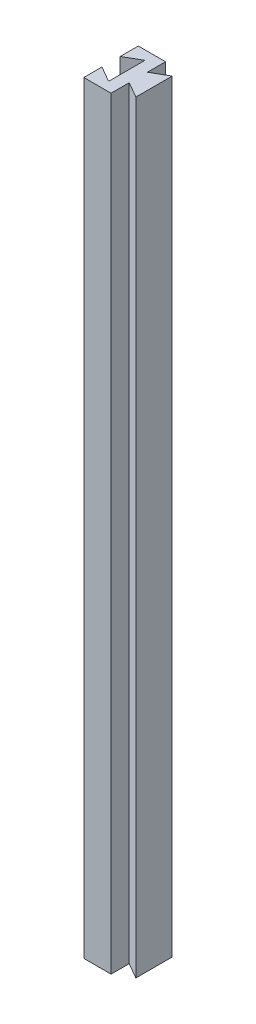
ISO-10303-21;
HEADER;
FILE_DESCRIPTION(('STEP AP214'),'2;1');
FILE_NAME('part.step','',(''),(''),'','','');
FILE_SCHEMA(('AUTOMOTIVE_DESIGN { 1 0 10303 214 1 1 1 1 }'));
ENDSEC;
DATA;
#1=APPLICATION_CONTEXT('core data for automotive mechanical design processes');
#2=APPLICATION_PROTOCOL_DEFINITION('international standard','automotive_design',2000,#1);
#3=PRODUCT_CONTEXT('',#1,'mechanical');
#4=PRODUCT('Part','Part','',(#3));
#5=PRODUCT_RELATED_PRODUCT_CATEGORY('part','',(#4));
#6=PRODUCT_DEFINITION_FORMATION('','',#4);
#7=PRODUCT_DEFINITION_CONTEXT('part definition',#1,'design');
#8=PRODUCT_DEFINITION('design','',#6,#7);
#9=PRODUCT_DEFINITION_SHAPE('','',#8);
#10=(LENGTH_UNIT() NAMED_UNIT(*) SI_UNIT(.MILLI.,.METRE.));
#11=(NAMED_UNIT(*) PLANE_ANGLE_UNIT() SI_UNIT($,.RADIAN.));
#12=(NAMED_UNIT(*) SI_UNIT($,.STERADIAN.) SOLID_ANGLE_UNIT());
#13=UNCERTAINTY_MEASURE_WITH_UNIT(LENGTH_MEASURE(1.E-05),#10,'distance_accuracy_value','');
#14=(GEOMETRIC_REPRESENTATION_CONTEXT(3) GLOBAL_UNCERTAINTY_ASSIGNED_CONTEXT((#13)) GLOBAL_UNIT_ASSIGNED_CONTEXT((#10,
#11,#12)) REPRESENTATION_CONTEXT('',''));
#15=CARTESIAN_POINT('',(0.,0.,0.));
#16=DIRECTION('',(0.,0.,1.));
#17=DIRECTION('',(1.,0.,0.));
#18=AXIS2_PLACEMENT_3D('',#15,#16,#17);
#19=CARTESIAN_POINT('',(-45.7953097514779,355.6,-6.96717641814465));
#20=DIRECTION('',(1.,0.,0.));
#21=DIRECTION('',(0.,0.,-1.));
#22=AXIS2_PLACEMENT_3D('',#19,#20,#21);
#23=PLANE('',#22);
#24=DIRECTION('',(0.,0.,1.));
#25=VECTOR('',#24,1.);
#26=CARTESIAN_POINT('',(-45.7953097514779,0.,-6.96717641814465));
#27=LINE('',#26,#25);
#28=CARTESIAN_POINT('',(-45.7953097514779,0.,-6.96717641814465));
#29=VERTEX_POINT('',#28);
#30=CARTESIAN_POINT('',(-45.7953097514779,0.,1.49949024852419));
#31=VERTEX_POINT('',#30);
#32=EDGE_CURVE('E153',#29,#31,#27,.T.);
#33=ORIENTED_EDGE('',*,*,#32,.T.);
#34=DIRECTION('',(0.,-1.,0.));
#35=VECTOR('',#34,1.);
#36=CARTESIAN_POINT('',(-45.7953097514779,355.6,1.49949024852419));
#37=LINE('',#36,#35);
#38=CARTESIAN_POINT('',(-45.7953097514779,355.6,1.49949024852419));
#39=VERTEX_POINT('',#38);
#40=EDGE_CURVE('E11',#39,#31,#37,.T.);
#41=ORIENTED_EDGE('',*,*,#40,.F.);
#42=DIRECTION('',(0.,0.,1.));
#43=VECTOR('',#42,1.);
#44=CARTESIAN_POINT('',(-45.7953097514779,355.6,-6.96717641814465));
#45=LINE('',#44,#43);
#46=CARTESIAN_POINT('',(-45.7953097514779,355.6,-6.96717641814465));
#47=VERTEX_POINT('',#46);
#48=EDGE_CURVE('E175',#47,#39,#45,.T.);
#49=ORIENTED_EDGE('',*,*,#48,.F.);
#50=DIRECTION('',(0.,-1.,0.));
#51=VECTOR('',#50,1.);
#52=CARTESIAN_POINT('',(-45.7953097514779,355.6,-6.96717641814465));
#53=LINE('',#52,#51);
#54=EDGE_CURVE('E149',#47,#29,#53,.T.);
#55=ORIENTED_EDGE('',*,*,#54,.T.);
#56=EDGE_LOOP('',(#33,#41,#49,#55));
#57=FACE_BOUND('',#56,.T.);
#58=ADVANCED_FACE('F33',(#57),#23,.F.);
#59=CARTESIAN_POINT('',(-38.4629613327699,355.6,-2.73384308480952));
#60=DIRECTION('',(-0.500000000000045,0.,-0.866025403784413));
#61=DIRECTION('',(-0.866025403784413,0.,0.500000000000045));
#62=AXIS2_PLACEMENT_3D('',#59,#60,#61);
#63=PLANE('',#62);
#64=DIRECTION('',(0.866025403784413,0.,-0.500000000000045));
#65=VECTOR('',#64,1.);
#66=CARTESIAN_POINT('',(-38.4629613327699,0.,-2.73384308480952));
#67=LINE('',#66,#65);
#68=CARTESIAN_POINT('',(-38.4629613327699,0.,-2.73384308480952));
#69=VERTEX_POINT('',#68);
#70=EDGE_CURVE('E156',#31,#69,#67,.T.);
#71=ORIENTED_EDGE('',*,*,#70,.T.);
#72=DIRECTION('',(0.,-1.,0.));
#73=VECTOR('',#72,1.);
#74=CARTESIAN_POINT('',(-38.4629613327699,355.6,-2.73384308480952));
#75=LINE('',#74,#73);
#76=CARTESIAN_POINT('',(-38.4629613327699,355.6,-2.73384308480952));
#77=VERTEX_POINT('',#76);
#78=EDGE_CURVE('E41',#77,#69,#75,.T.);
#79=ORIENTED_EDGE('',*,*,#78,.F.);
#80=DIRECTION('',(0.866025403784413,0.,-0.500000000000045));
#81=VECTOR('',#80,1.);
#82=CARTESIAN_POINT('',(-38.4629613327699,355.6,-2.73384308480952));
#83=LINE('',#82,#81);
#84=EDGE_CURVE('E104',#39,#77,#83,.T.);
#85=ORIENTED_EDGE('',*,*,#84,.F.);
#86=ORIENTED_EDGE('',*,*,#40,.T.);
#87=EDGE_LOOP('',(#71,#79,#85,#86));
#88=FACE_BOUND('',#87,.T.);
#89=ADVANCED_FACE('F253',(#88),#63,.F.);
#90=CARTESIAN_POINT('',(-38.4629613327699,355.6,14.1994902485238));
#91=DIRECTION('',(1.,0.,0.));
#92=DIRECTION('',(0.,0.,-1.));
#93=AXIS2_PLACEMENT_3D('',#90,#91,#92);
#94=PLANE('',#93);
#95=DIRECTION('',(0.,0.,1.));
#96=VECTOR('',#95,1.);
#97=CARTESIAN_POINT('',(-38.4629613327699,0.,14.1994902485238));
#98=LINE('',#97,#96);
#99=CARTESIAN_POINT('',(-38.4629613327699,0.,14.1994902485238));
#100=VERTEX_POINT('',#99);
#101=EDGE_CURVE('E158',#69,#100,#98,.T.);
#102=ORIENTED_EDGE('',*,*,#101,.T.);
#103=DIRECTION('',(0.,-1.,0.));
#104=VECTOR('',#103,1.);
#105=CARTESIAN_POINT('',(-38.4629613327699,355.6,14.1994902485238));
#106=LINE('',#105,#104);
#107=CARTESIAN_POINT('',(-38.4629613327699,355.6,14.1994902485238));
#108=VERTEX_POINT('',#107);
#109=EDGE_CURVE('E194',#108,#100,#106,.T.);
#110=ORIENTED_EDGE('',*,*,#109,.F.);
#111=DIRECTION('',(0.,0.,1.));
#112=VECTOR('',#111,1.);
#113=CARTESIAN_POINT('',(-38.4629613327699,355.6,14.1994902485238));
#114=LINE('',#113,#112);
#115=EDGE_CURVE('E202',#77,#108,#114,.T.);
#116=ORIENTED_EDGE('',*,*,#115,.F.);
#117=ORIENTED_EDGE('',*,*,#78,.T.);
#118=EDGE_LOOP('',(#102,#110,#116,#117));
#119=FACE_BOUND('',#118,.T.);
#120=ADVANCED_FACE('F200',(#119),#94,.F.);
#121=CARTESIAN_POINT('',(-45.7953097514779,355.6,9.96615691519011));
#122=DIRECTION('',(-0.500000000000043,0.,0.866025403784414));
#123=DIRECTION('',(0.866025403784414,0.,0.500000000000043));
#124=AXIS2_PLACEMENT_3D('',#121,#122,#123);
#125=PLANE('',#124);
#126=DIRECTION('',(-0.866025403784414,0.,-0.500000000000043));
#127=VECTOR('',#126,1.);
#128=CARTESIAN_POINT('',(-45.7953097514779,0.,9.96615691519011));
#129=LINE('',#128,#127);
#130=CARTESIAN_POINT('',(-45.7953097514779,0.,9.96615691519011));
#131=VERTEX_POINT('',#130);
#132=EDGE_CURVE('E160',#100,#131,#129,.T.);
#133=ORIENTED_EDGE('',*,*,#132,.T.);
#134=DIRECTION('',(0.,-1.,0.));
#135=VECTOR('',#134,1.);
#136=CARTESIAN_POINT('',(-45.7953097514779,355.6,9.96615691519011));
#137=LINE('',#136,#135);
#138=CARTESIAN_POINT('',(-45.7953097514779,355.6,9.96615691519011));
#139=VERTEX_POINT('',#138);
#140=EDGE_CURVE('E191',#139,#131,#137,.T.);
#141=ORIENTED_EDGE('',*,*,#140,.F.);
#142=DIRECTION('',(-0.866025403784414,0.,-0.500000000000043));
#143=VECTOR('',#142,1.);
#144=CARTESIAN_POINT('',(-45.7953097514779,355.6,9.96615691519011));
#145=LINE('',#144,#143);
#146=EDGE_CURVE('E220',#108,#139,#145,.T.);
#147=ORIENTED_EDGE('',*,*,#146,.F.);
#148=ORIENTED_EDGE('',*,*,#109,.T.);
#149=EDGE_LOOP('',(#133,#141,#147,#148));
#150=FACE_BOUND('',#149,.T.);
#151=ADVANCED_FACE('F211',(#150),#125,.F.);
#152=CARTESIAN_POINT('',(-45.7953097514779,355.6,9.96615691519011));
#153=DIRECTION('',(1.,0.,0.));
#154=DIRECTION('',(0.,0.,-1.));
#155=AXIS2_PLACEMENT_3D('',#152,#153,#154);
#156=PLANE('',#155);
#157=DIRECTION('',(0.,0.,1.));
#158=VECTOR('',#157,1.);
#159=CARTESIAN_POINT('',(-45.7953097514779,0.,9.96615691519011));
#160=LINE('',#159,#158);
#161=CARTESIAN_POINT('',(-45.7953097514779,0.,18.4328235818553));
#162=VERTEX_POINT('',#161);
#163=EDGE_CURVE('E162',#131,#162,#160,.T.);
#164=ORIENTED_EDGE('',*,*,#163,.T.);
#165=DIRECTION('',(0.,-1.,0.));
#166=VECTOR('',#165,1.);
#167=CARTESIAN_POINT('',(-45.7953097514779,355.6,18.4328235818553));
#168=LINE('',#167,#166);
#169=CARTESIAN_POINT('',(-45.7953097514779,355.6,18.4328235818553));
#170=VERTEX_POINT('',#169);
#171=EDGE_CURVE('E188',#170,#162,#168,.T.);
#172=ORIENTED_EDGE('',*,*,#171,.F.);
#173=DIRECTION('',(0.,0.,1.));
#174=VECTOR('',#173,1.);
#175=CARTESIAN_POINT('',(-45.7953097514779,355.6,9.96615691519011));
#176=LINE('',#175,#174);
#177=EDGE_CURVE('E217',#139,#170,#176,.T.);
#178=ORIENTED_EDGE('',*,*,#177,.F.);
#179=ORIENTED_EDGE('',*,*,#140,.T.);
#180=EDGE_LOOP('',(#164,#172,#178,#179));
#181=FACE_BOUND('',#180,.T.);
#182=ADVANCED_FACE('F215',(#181),#156,.F.);
#183=CARTESIAN_POINT('',(-45.7953097514779,355.6,18.4328235818553));
#184=DIRECTION('',(0.,0.,-1.));
#185=DIRECTION('',(-1.,0.,0.));
#186=AXIS2_PLACEMENT_3D('',#183,#184,#185);
#187=PLANE('',#186);
#188=DIRECTION('',(1.,0.,0.));
#189=VECTOR('',#188,1.);
#190=CARTESIAN_POINT('',(-45.7953097514779,0.,18.4328235818553));
#191=LINE('',#190,#189);
#192=CARTESIAN_POINT('',(-33.0953097514779,0.,18.4328235818553));
#193=VERTEX_POINT('',#192);
#194=EDGE_CURVE('E164',#162,#193,#191,.T.);
#195=ORIENTED_EDGE('',*,*,#194,.T.);
#196=DIRECTION('',(0.,-1.,0.));
#197=VECTOR('',#196,1.);
#198=CARTESIAN_POINT('',(-33.0953097514779,355.6,18.4328235818553));
#199=LINE('',#198,#197);
#200=CARTESIAN_POINT('',(-33.0953097514779,355.6,18.4328235818553));
#201=VERTEX_POINT('',#200);
#202=EDGE_CURVE('E185',#201,#193,#199,.T.);
#203=ORIENTED_EDGE('',*,*,#202,.F.);
#204=DIRECTION('',(1.,0.,0.));
#205=VECTOR('',#204,1.);
#206=CARTESIAN_POINT('',(-45.7953097514779,355.6,18.4328235818553));
#207=LINE('',#206,#205);
#208=EDGE_CURVE('E219',#170,#201,#207,.T.);
#209=ORIENTED_EDGE('',*,*,#208,.F.);
#210=ORIENTED_EDGE('',*,*,#171,.T.);
#211=EDGE_LOOP('',(#195,#203,#209,#210));
#212=FACE_BOUND('',#211,.T.);
#213=ADVANCED_FACE('F266',(#212),#187,.F.);
#214=CARTESIAN_POINT('',(-33.0953097514779,355.6,18.4328235818553));
#215=DIRECTION('',(-1.,0.,0.));
#216=DIRECTION('',(0.,0.,1.));
#217=AXIS2_PLACEMENT_3D('',#214,#215,#216);
#218=PLANE('',#217);
#219=DIRECTION('',(0.,0.,-1.));
#220=VECTOR('',#219,1.);
#221=CARTESIAN_POINT('',(-33.0953097514779,0.,18.4328235818553));
#222=LINE('',#221,#220);
#223=CARTESIAN_POINT('',(-33.0953097514779,0.,9.96615691518868));
#224=VERTEX_POINT('',#223);
#225=EDGE_CURVE('E166',#193,#224,#222,.T.);
#226=ORIENTED_EDGE('',*,*,#225,.T.);
#227=DIRECTION('',(0.,-1.,0.));
#228=VECTOR('',#227,1.);
#229=CARTESIAN_POINT('',(-33.0953097514779,355.6,9.96615691518868));
#230=LINE('',#229,#228);
#231=CARTESIAN_POINT('',(-33.0953097514779,355.6,9.96615691518868));
#232=VERTEX_POINT('',#231);
#233=EDGE_CURVE('E182',#232,#224,#230,.T.);
#234=ORIENTED_EDGE('',*,*,#233,.F.);
#235=DIRECTION('',(0.,0.,-1.));
#236=VECTOR('',#235,1.);
#237=CARTESIAN_POINT('',(-33.0953097514779,355.6,18.4328235818553));
#238=LINE('',#237,#236);
#239=EDGE_CURVE('E222',#201,#232,#238,.T.);
#240=ORIENTED_EDGE('',*,*,#239,.F.);
#241=ORIENTED_EDGE('',*,*,#202,.T.);
#242=EDGE_LOOP('',(#226,#234,#240,#241));
#243=FACE_BOUND('',#242,.T.);
#244=ADVANCED_FACE('F269',(#243),#218,.F.);
#245=CARTESIAN_POINT('',(-33.0953097514779,355.6,9.96615691518868));
#246=DIRECTION('',(0.500000000000063,0.,-0.866025403784402));
#247=DIRECTION('',(-0.866025403784402,0.,-0.500000000000063));
#248=AXIS2_PLACEMENT_3D('',#245,#246,#247);
#249=PLANE('',#248);
#250=DIRECTION('',(0.866025403784402,0.,0.500000000000063));
#251=VECTOR('',#250,1.);
#252=CARTESIAN_POINT('',(-33.0953097514779,0.,9.96615691518868));
#253=LINE('',#252,#251);
#254=CARTESIAN_POINT('',(-25.76296133277,0.,14.1994902485226));
#255=VERTEX_POINT('',#254);
#256=EDGE_CURVE('E168',#224,#255,#253,.T.);
#257=ORIENTED_EDGE('',*,*,#256,.T.);
#258=DIRECTION('',(0.,-1.,0.));
#259=VECTOR('',#258,1.);
#260=CARTESIAN_POINT('',(-25.76296133277,355.6,14.1994902485226));
#261=LINE('',#260,#259);
#262=CARTESIAN_POINT('',(-25.76296133277,355.6,14.1994902485226));
#263=VERTEX_POINT('',#262);
#264=EDGE_CURVE('E179',#263,#255,#261,.T.);
#265=ORIENTED_EDGE('',*,*,#264,.F.);
#266=DIRECTION('',(0.866025403784402,0.,0.500000000000063));
#267=VECTOR('',#266,1.);
#268=CARTESIAN_POINT('',(-33.0953097514779,355.6,9.96615691518868));
#269=LINE('',#268,#267);
#270=EDGE_CURVE('E228',#232,#263,#269,.T.);
#271=ORIENTED_EDGE('',*,*,#270,.F.);
#272=ORIENTED_EDGE('',*,*,#233,.T.);
#273=EDGE_LOOP('',(#257,#265,#271,#272));
#274=FACE_BOUND('',#273,.T.);
#275=ADVANCED_FACE('F234',(#274),#249,.F.);
#276=CARTESIAN_POINT('',(-25.76296133277,355.6,-2.73384308481078));
#277=DIRECTION('',(-1.,0.,0.));
#278=DIRECTION('',(0.,0.,1.));
#279=AXIS2_PLACEMENT_3D('',#276,#277,#278);
#280=PLANE('',#279);
#281=DIRECTION('',(0.,0.,-1.));
#282=VECTOR('',#281,1.);
#283=CARTESIAN_POINT('',(-25.76296133277,0.,-2.73384308481078));
#284=LINE('',#283,#282);
#285=CARTESIAN_POINT('',(-25.76296133277,0.,-2.73384308481078));
#286=VERTEX_POINT('',#285);
#287=EDGE_CURVE('E170',#255,#286,#284,.T.);
#288=ORIENTED_EDGE('',*,*,#287,.T.);
#289=DIRECTION('',(0.,-1.,0.));
#290=VECTOR('',#289,1.);
#291=CARTESIAN_POINT('',(-25.76296133277,355.6,-2.73384308481078));
#292=LINE('',#291,#290);
#293=CARTESIAN_POINT('',(-25.76296133277,355.6,-2.73384308481078));
#294=VERTEX_POINT('',#293);
#295=EDGE_CURVE('E144',#294,#286,#292,.T.);
#296=ORIENTED_EDGE('',*,*,#295,.F.);
#297=DIRECTION('',(0.,0.,-1.));
#298=VECTOR('',#297,1.);
#299=CARTESIAN_POINT('',(-25.76296133277,355.6,-2.73384308481078));
#300=LINE('',#299,#298);
#301=EDGE_CURVE('E135',#263,#294,#300,.T.);
#302=ORIENTED_EDGE('',*,*,#301,.F.);
#303=ORIENTED_EDGE('',*,*,#264,.T.);
#304=EDGE_LOOP('',(#288,#296,#302,#303));
#305=FACE_BOUND('',#304,.T.);
#306=ADVANCED_FACE('F238',(#305),#280,.F.);
#307=CARTESIAN_POINT('',(-33.0953097514785,355.6,1.49949024852201));
#308=DIRECTION('',(0.499999999999936,0.,0.866025403784475));
#309=DIRECTION('',(0.866025403784475,0.,-0.499999999999936));
#310=AXIS2_PLACEMENT_3D('',#307,#308,#309);
#311=PLANE('',#310);
#312=DIRECTION('',(-0.866025403784475,0.,0.499999999999936));
#313=VECTOR('',#312,1.);
#314=CARTESIAN_POINT('',(-33.0953097514785,0.,1.49949024852201));
#315=LINE('',#314,#313);
#316=CARTESIAN_POINT('',(-33.0953097514785,0.,1.49949024852201));
#317=VERTEX_POINT('',#316);
#318=EDGE_CURVE('E143',#286,#317,#315,.T.);
#319=ORIENTED_EDGE('',*,*,#318,.T.);
#320=DIRECTION('',(0.,-1.,0.));
#321=VECTOR('',#320,1.);
#322=CARTESIAN_POINT('',(-33.0953097514785,355.6,1.49949024852201));
#323=LINE('',#322,#321);
#324=CARTESIAN_POINT('',(-33.0953097514785,355.6,1.49949024852201));
#325=VERTEX_POINT('',#324);
#326=EDGE_CURVE('E140',#325,#317,#323,.T.);
#327=ORIENTED_EDGE('',*,*,#326,.F.);
#328=DIRECTION('',(-0.866025403784475,0.,0.499999999999936));
#329=VECTOR('',#328,1.);
#330=CARTESIAN_POINT('',(-33.0953097514785,355.6,1.49949024852201));
#331=LINE('',#330,#329);
#332=EDGE_CURVE('E129',#294,#325,#331,.T.);
#333=ORIENTED_EDGE('',*,*,#332,.F.);
#334=ORIENTED_EDGE('',*,*,#295,.T.);
#335=EDGE_LOOP('',(#319,#327,#333,#334));
#336=FACE_BOUND('',#335,.T.);
#337=ADVANCED_FACE('F141',(#336),#311,.F.);
#338=CARTESIAN_POINT('',(-33.0953097514785,355.6,-6.96717641814465));
#339=DIRECTION('',(-1.,0.,0.));
#340=DIRECTION('',(0.,0.,1.));
#341=AXIS2_PLACEMENT_3D('',#338,#339,#340);
#342=PLANE('',#341);
#343=DIRECTION('',(0.,0.,-1.));
#344=VECTOR('',#343,1.);
#345=CARTESIAN_POINT('',(-33.0953097514785,0.,-6.96717641814465));
#346=LINE('',#345,#344);
#347=CARTESIAN_POINT('',(-33.0953097514785,0.,-6.96717641814465));
#348=VERTEX_POINT('',#347);
#349=EDGE_CURVE('E90',#317,#348,#346,.T.);
#350=ORIENTED_EDGE('',*,*,#349,.T.);
#351=DIRECTION('',(0.,-1.,0.));
#352=VECTOR('',#351,1.);
#353=CARTESIAN_POINT('',(-33.0953097514785,355.6,-6.96717641814465));
#354=LINE('',#353,#352);
#355=CARTESIAN_POINT('',(-33.0953097514785,355.6,-6.96717641814465));
#356=VERTEX_POINT('',#355);
#357=EDGE_CURVE('E145',#356,#348,#354,.T.);
#358=ORIENTED_EDGE('',*,*,#357,.F.);
#359=DIRECTION('',(0.,0.,-1.));
#360=VECTOR('',#359,1.);
#361=CARTESIAN_POINT('',(-33.0953097514785,355.6,-6.96717641814465));
#362=LINE('',#361,#360);
#363=EDGE_CURVE('E133',#325,#356,#362,.T.);
#364=ORIENTED_EDGE('',*,*,#363,.F.);
#365=ORIENTED_EDGE('',*,*,#326,.T.);
#366=EDGE_LOOP('',(#350,#358,#364,#365));
#367=FACE_BOUND('',#366,.T.);
#368=ADVANCED_FACE('F147',(#367),#342,.F.);
#369=CARTESIAN_POINT('',(-33.0953097514785,355.6,-6.96717641814465));
#370=DIRECTION('',(0.,0.,1.));
#371=DIRECTION('',(1.,0.,0.));
#372=AXIS2_PLACEMENT_3D('',#369,#370,#371);
#373=PLANE('',#372);
#374=DIRECTION('',(-1.,0.,0.));
#375=VECTOR('',#374,1.);
#376=CARTESIAN_POINT('',(-33.0953097514785,0.,-6.96717641814465));
#377=LINE('',#376,#375);
#378=EDGE_CURVE('E96',#348,#29,#377,.T.);
#379=ORIENTED_EDGE('',*,*,#378,.T.);
#380=ORIENTED_EDGE('',*,*,#54,.F.);
#381=DIRECTION('',(-1.,0.,0.));
#382=VECTOR('',#381,1.);
#383=CARTESIAN_POINT('',(-33.0953097514785,355.6,-6.96717641814465));
#384=LINE('',#383,#382);
#385=EDGE_CURVE('E49',#356,#47,#384,.T.);
#386=ORIENTED_EDGE('',*,*,#385,.F.);
#387=ORIENTED_EDGE('',*,*,#357,.T.);
#388=EDGE_LOOP('',(#379,#380,#386,#387));
#389=FACE_BOUND('',#388,.T.);
#390=ADVANCED_FACE('F242',(#389),#373,.F.);
#391=CARTESIAN_POINT('',(0.,355.6,0.));
#392=DIRECTION('',(0.,1.,0.));
#393=DIRECTION('',(0.,0.,1.));
#394=AXIS2_PLACEMENT_3D('',#391,#392,#393);
#395=PLANE('',#394);
#396=ORIENTED_EDGE('',*,*,#48,.T.);
#397=ORIENTED_EDGE('',*,*,#84,.T.);
#398=ORIENTED_EDGE('',*,*,#115,.T.);
#399=ORIENTED_EDGE('',*,*,#146,.T.);
#400=ORIENTED_EDGE('',*,*,#177,.T.);
#401=ORIENTED_EDGE('',*,*,#208,.T.);
#402=ORIENTED_EDGE('',*,*,#239,.T.);
#403=ORIENTED_EDGE('',*,*,#270,.T.);
#404=ORIENTED_EDGE('',*,*,#301,.T.);
#405=ORIENTED_EDGE('',*,*,#332,.T.);
#406=ORIENTED_EDGE('',*,*,#363,.T.);
#407=ORIENTED_EDGE('',*,*,#385,.T.);
#408=EDGE_LOOP('',(#396,#397,#398,#399,#400,#401,#402,#403,#404,#405,#406,#407));
#409=FACE_BOUND('',#408,.T.);
#410=ADVANCED_FACE('F131',(#409),#395,.T.);
#411=CARTESIAN_POINT('',(0.,0.,0.));
#412=DIRECTION('',(0.,1.,0.));
#413=DIRECTION('',(0.,0.,1.));
#414=AXIS2_PLACEMENT_3D('',#411,#412,#413);
#415=PLANE('',#414);
#416=ORIENTED_EDGE('',*,*,#32,.F.);
#417=ORIENTED_EDGE('',*,*,#378,.F.);
#418=ORIENTED_EDGE('',*,*,#349,.F.);
#419=ORIENTED_EDGE('',*,*,#318,.F.);
#420=ORIENTED_EDGE('',*,*,#287,.F.);
#421=ORIENTED_EDGE('',*,*,#256,.F.);
#422=ORIENTED_EDGE('',*,*,#225,.F.);
#423=ORIENTED_EDGE('',*,*,#194,.F.);
#424=ORIENTED_EDGE('',*,*,#163,.F.);
#425=ORIENTED_EDGE('',*,*,#132,.F.);
#426=ORIENTED_EDGE('',*,*,#101,.F.);
#427=ORIENTED_EDGE('',*,*,#70,.F.);
#428=EDGE_LOOP('',(#416,#417,#418,#419,#420,#421,#422,#423,#424,#425,#426,#427));
#429=FACE_BOUND('',#428,.T.);
#430=ADVANCED_FACE('F206',(#429),#415,.F.);
#431=CLOSED_SHELL('',(#58,#89,#120,#151,#182,#213,#244,#275,#306,#337,#368,#390,#410,#430));
#432=MANIFOLD_SOLID_BREP('B2',#431);
#433=ADVANCED_BREP_SHAPE_REPRESENTATION('',(#18,#432),#14);
#434=SHAPE_DEFINITION_REPRESENTATION(#9,#433);
ENDSEC;
END-ISO-10303-21;
